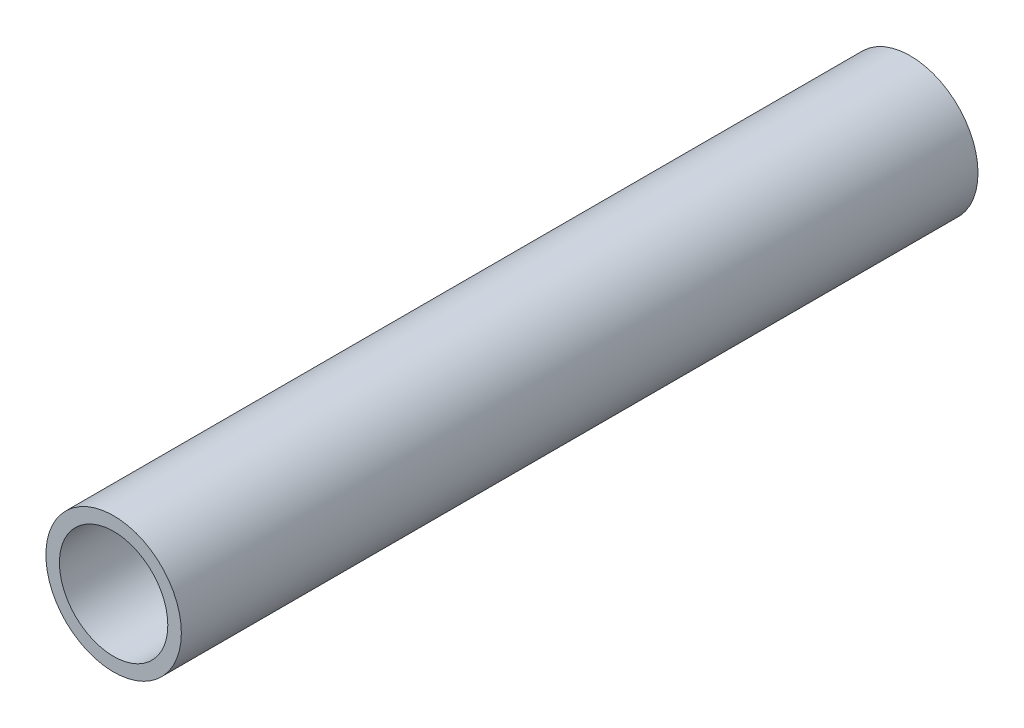
ISO-10303-21;
HEADER;
FILE_DESCRIPTION(('STEP AP214'),'2;1');
FILE_NAME('part.step','',(''),(''),'','','');
FILE_SCHEMA(('AUTOMOTIVE_DESIGN { 1 0 10303 214 1 1 1 1 }'));
ENDSEC;
DATA;
#1=APPLICATION_CONTEXT('core data for automotive mechanical design processes');
#2=APPLICATION_PROTOCOL_DEFINITION('international standard','automotive_design',2000,#1);
#3=PRODUCT_CONTEXT('',#1,'mechanical');
#4=PRODUCT('Part','Part','',(#3));
#5=PRODUCT_RELATED_PRODUCT_CATEGORY('part','',(#4));
#6=PRODUCT_DEFINITION_FORMATION('','',#4);
#7=PRODUCT_DEFINITION_CONTEXT('part definition',#1,'design');
#8=PRODUCT_DEFINITION('design','',#6,#7);
#9=PRODUCT_DEFINITION_SHAPE('','',#8);
#10=(LENGTH_UNIT() NAMED_UNIT(*) SI_UNIT(.MILLI.,.METRE.));
#11=(NAMED_UNIT(*) PLANE_ANGLE_UNIT() SI_UNIT($,.RADIAN.));
#12=(NAMED_UNIT(*) SI_UNIT($,.STERADIAN.) SOLID_ANGLE_UNIT());
#13=UNCERTAINTY_MEASURE_WITH_UNIT(LENGTH_MEASURE(1.E-05),#10,'distance_accuracy_value','');
#14=(GEOMETRIC_REPRESENTATION_CONTEXT(3) GLOBAL_UNCERTAINTY_ASSIGNED_CONTEXT((#13)) GLOBAL_UNIT_ASSIGNED_CONTEXT((#10,
#11,#12)) REPRESENTATION_CONTEXT('',''));
#15=CARTESIAN_POINT('',(0.,0.,0.));
#16=DIRECTION('',(0.,0.,1.));
#17=DIRECTION('',(1.,0.,0.));
#18=AXIS2_PLACEMENT_3D('',#15,#16,#17);
#19=CARTESIAN_POINT('',(0.,0.,-14.7));
#20=DIRECTION('',(0.,0.,1.));
#21=DIRECTION('',(1.,0.,0.));
#22=AXIS2_PLACEMENT_3D('',#19,#20,#21);
#23=CYLINDRICAL_SURFACE('',#22,1.25);
#24=CARTESIAN_POINT('',(0.,0.,-14.7));
#25=DIRECTION('',(0.,0.,1.));
#26=DIRECTION('',(1.,0.,0.));
#27=AXIS2_PLACEMENT_3D('',#24,#25,#26);
#28=CIRCLE('',#27,1.25);
#29=CARTESIAN_POINT('',(1.25,0.,-14.7));
#30=VERTEX_POINT('',#29);
#31=EDGE_CURVE('E10',#30,#30,#28,.T.);
#32=ORIENTED_EDGE('',*,*,#31,.T.);
#33=EDGE_LOOP('',(#32));
#34=FACE_BOUND('',#33,.T.);
#35=CARTESIAN_POINT('',(0.,0.,0.));
#36=DIRECTION('',(0.,0.,1.));
#37=DIRECTION('',(1.,0.,0.));
#38=AXIS2_PLACEMENT_3D('',#35,#36,#37);
#39=CIRCLE('',#38,1.25);
#40=CARTESIAN_POINT('',(1.25,0.,0.));
#41=VERTEX_POINT('',#40);
#42=EDGE_CURVE('E38',#41,#41,#39,.T.);
#43=ORIENTED_EDGE('',*,*,#42,.F.);
#44=EDGE_LOOP('',(#43));
#45=FACE_BOUND('',#44,.T.);
#46=ADVANCED_FACE('F35',(#34,#45),#23,.T.);
#47=CARTESIAN_POINT('',(0.,0.,-14.7));
#48=DIRECTION('',(0.,0.,1.));
#49=DIRECTION('',(1.,0.,0.));
#50=AXIS2_PLACEMENT_3D('',#47,#48,#49);
#51=PLANE('',#50);
#52=CARTESIAN_POINT('',(0.,0.,-14.7));
#53=DIRECTION('',(0.,0.,1.));
#54=DIRECTION('',(1.,0.,0.));
#55=AXIS2_PLACEMENT_3D('',#52,#53,#54);
#56=CIRCLE('',#55,1.);
#57=CARTESIAN_POINT('',(1.,0.,-14.7));
#58=VERTEX_POINT('',#57);
#59=EDGE_CURVE('E45',#58,#58,#56,.T.);
#60=ORIENTED_EDGE('',*,*,#59,.T.);
#61=EDGE_LOOP('',(#60));
#62=FACE_BOUND('',#61,.T.);
#63=ORIENTED_EDGE('',*,*,#31,.F.);
#64=EDGE_LOOP('',(#63));
#65=FACE_BOUND('',#64,.T.);
#66=ADVANCED_FACE('F53',(#62,#65),#51,.F.);
#67=CARTESIAN_POINT('',(0.,0.,0.));
#68=DIRECTION('',(0.,0.,1.));
#69=DIRECTION('',(1.,0.,0.));
#70=AXIS2_PLACEMENT_3D('',#67,#68,#69);
#71=PLANE('',#70);
#72=CARTESIAN_POINT('',(0.,0.,0.));
#73=DIRECTION('',(0.,0.,1.));
#74=DIRECTION('',(1.,0.,0.));
#75=AXIS2_PLACEMENT_3D('',#72,#73,#74);
#76=CIRCLE('',#75,1.);
#77=CARTESIAN_POINT('',(1.,0.,0.));
#78=VERTEX_POINT('',#77);
#79=EDGE_CURVE('E47',#78,#78,#76,.T.);
#80=ORIENTED_EDGE('',*,*,#79,.F.);
#81=EDGE_LOOP('',(#80));
#82=FACE_BOUND('',#81,.T.);
#83=ORIENTED_EDGE('',*,*,#42,.T.);
#84=EDGE_LOOP('',(#83));
#85=FACE_BOUND('',#84,.T.);
#86=ADVANCED_FACE('F59',(#82,#85),#71,.T.);
#87=CARTESIAN_POINT('',(0.,0.,-14.7));
#88=DIRECTION('',(0.,0.,1.));
#89=DIRECTION('',(1.,0.,0.));
#90=AXIS2_PLACEMENT_3D('',#87,#88,#89);
#91=CYLINDRICAL_SURFACE('',#90,1.);
#92=ORIENTED_EDGE('',*,*,#59,.F.);
#93=EDGE_LOOP('',(#92));
#94=FACE_BOUND('',#93,.T.);
#95=ORIENTED_EDGE('',*,*,#79,.T.);
#96=EDGE_LOOP('',(#95));
#97=FACE_BOUND('',#96,.T.);
#98=ADVANCED_FACE('F56',(#94,#97),#91,.F.);
#99=CLOSED_SHELL('',(#46,#66,#86,#98));
#100=MANIFOLD_SOLID_BREP('B2',#99);
#101=ADVANCED_BREP_SHAPE_REPRESENTATION('',(#18,#100),#14);
#102=SHAPE_DEFINITION_REPRESENTATION(#9,#101);
ENDSEC;
END-ISO-10303-21;
